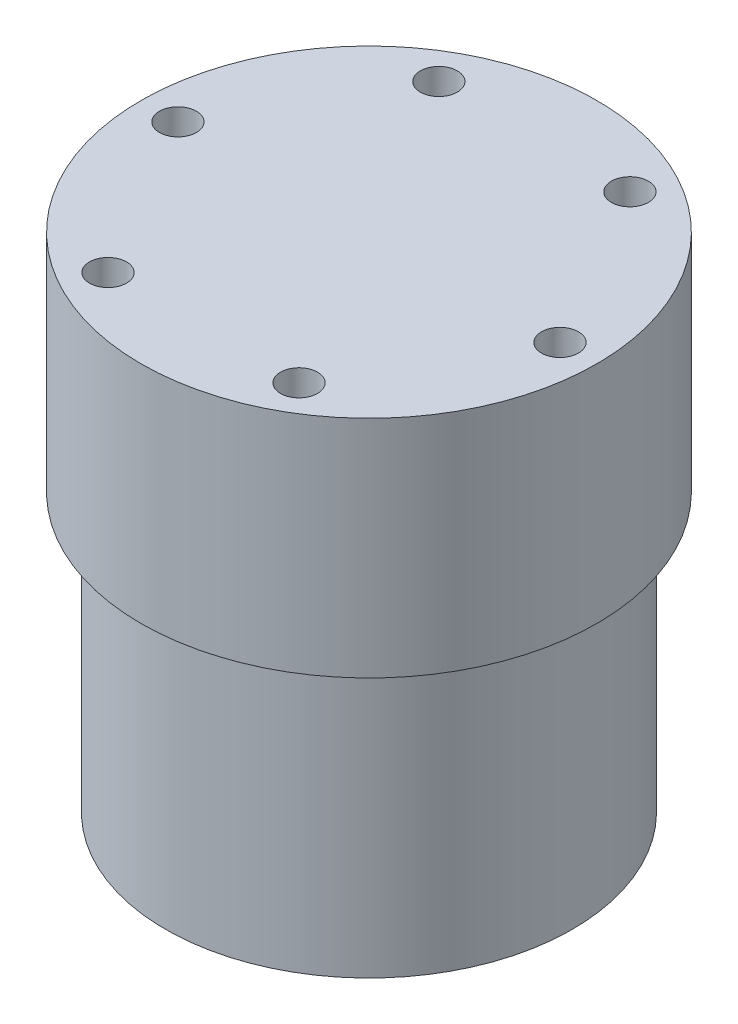
ISO-10303-21;
HEADER;
FILE_DESCRIPTION(('STEP AP214'),'2;1');
FILE_NAME('part.step','',(''),(''),'','','');
FILE_SCHEMA(('AUTOMOTIVE_DESIGN { 1 0 10303 214 1 1 1 1 }'));
ENDSEC;
DATA;
#1=APPLICATION_CONTEXT('core data for automotive mechanical design processes');
#2=APPLICATION_PROTOCOL_DEFINITION('international standard','automotive_design',2000,#1);
#3=PRODUCT_CONTEXT('',#1,'mechanical');
#4=PRODUCT('Part','Part','',(#3));
#5=PRODUCT_RELATED_PRODUCT_CATEGORY('part','',(#4));
#6=PRODUCT_DEFINITION_FORMATION('','',#4);
#7=PRODUCT_DEFINITION_CONTEXT('part definition',#1,'design');
#8=PRODUCT_DEFINITION('design','',#6,#7);
#9=PRODUCT_DEFINITION_SHAPE('','',#8);
#10=(LENGTH_UNIT() NAMED_UNIT(*) SI_UNIT(.MILLI.,.METRE.));
#11=(NAMED_UNIT(*) PLANE_ANGLE_UNIT() SI_UNIT($,.RADIAN.));
#12=(NAMED_UNIT(*) SI_UNIT($,.STERADIAN.) SOLID_ANGLE_UNIT());
#13=UNCERTAINTY_MEASURE_WITH_UNIT(LENGTH_MEASURE(1.E-05),#10,'distance_accuracy_value','');
#14=(GEOMETRIC_REPRESENTATION_CONTEXT(3) GLOBAL_UNCERTAINTY_ASSIGNED_CONTEXT((#13)) GLOBAL_UNIT_ASSIGNED_CONTEXT((#10,
#11,#12)) REPRESENTATION_CONTEXT('',''));
#15=CARTESIAN_POINT('',(0.,0.,0.));
#16=DIRECTION('',(0.,0.,1.));
#17=DIRECTION('',(1.,0.,0.));
#18=AXIS2_PLACEMENT_3D('',#15,#16,#17);
#19=CARTESIAN_POINT('',(0.,22.5,0.));
#20=DIRECTION('',(0.,-1.,0.));
#21=DIRECTION('',(0.,0.,-1.));
#22=AXIS2_PLACEMENT_3D('',#19,#20,#21);
#23=CYLINDRICAL_SURFACE('',#22,16.5);
#24=CARTESIAN_POINT('',(0.,22.5,0.));
#25=DIRECTION('',(0.,1.,0.));
#26=DIRECTION('',(0.,0.,1.));
#27=AXIS2_PLACEMENT_3D('',#24,#25,#26);
#28=CIRCLE('',#27,16.5);
#29=CARTESIAN_POINT('',(0.,22.5,-16.5));
#30=VERTEX_POINT('',#29);
#31=EDGE_CURVE('E10',#30,#30,#28,.T.);
#32=CARTESIAN_POINT('',(0.,0.,0.));
#33=DIRECTION('',(0.,1.,0.));
#34=DIRECTION('',(0.,0.,1.));
#35=AXIS2_PLACEMENT_3D('',#32,#33,#34);
#36=CIRCLE('',#35,16.5);
#37=CARTESIAN_POINT('',(0.,0.,-16.5));
#38=VERTEX_POINT('',#37);
#39=EDGE_CURVE('E33',#38,#38,#36,.T.);
#40=CARTESIAN_POINT('',(0.,22.5,-16.5));
#41=CARTESIAN_POINT('',(0.,22.265625,-16.5));
#42=CARTESIAN_POINT('',(0.,22.03125,-16.5));
#43=CARTESIAN_POINT('',(0.,21.5625,-16.5));
#44=CARTESIAN_POINT('',(0.,21.328125,-16.5));
#45=CARTESIAN_POINT('',(0.,20.859375,-16.5));
#46=CARTESIAN_POINT('',(0.,20.625,-16.5));
#47=CARTESIAN_POINT('',(0.,20.15625,-16.5));
#48=CARTESIAN_POINT('',(0.,19.921875,-16.5));
#49=CARTESIAN_POINT('',(0.,19.453125,-16.5));
#50=CARTESIAN_POINT('',(0.,19.21875,-16.5));
#51=CARTESIAN_POINT('',(0.,18.75,-16.5));
#52=CARTESIAN_POINT('',(0.,18.515625,-16.5));
#53=CARTESIAN_POINT('',(0.,18.046875,-16.5));
#54=CARTESIAN_POINT('',(0.,17.8125,-16.5));
#55=CARTESIAN_POINT('',(0.,17.34375,-16.5));
#56=CARTESIAN_POINT('',(0.,17.109375,-16.5));
#57=CARTESIAN_POINT('',(0.,16.640625,-16.5));
#58=CARTESIAN_POINT('',(0.,16.40625,-16.5));
#59=CARTESIAN_POINT('',(0.,15.9375,-16.5));
#60=CARTESIAN_POINT('',(0.,15.703125,-16.5));
#61=CARTESIAN_POINT('',(0.,15.234375,-16.5));
#62=CARTESIAN_POINT('',(0.,15.,-16.5));
#63=CARTESIAN_POINT('',(0.,14.53125,-16.5));
#64=CARTESIAN_POINT('',(0.,14.296875,-16.5));
#65=CARTESIAN_POINT('',(0.,13.828125,-16.5));
#66=CARTESIAN_POINT('',(0.,13.59375,-16.5));
#67=CARTESIAN_POINT('',(0.,13.125,-16.5));
#68=CARTESIAN_POINT('',(0.,12.890625,-16.5));
#69=CARTESIAN_POINT('',(0.,12.421875,-16.5));
#70=CARTESIAN_POINT('',(0.,12.1875,-16.5));
#71=CARTESIAN_POINT('',(0.,11.71875,-16.5));
#72=CARTESIAN_POINT('',(0.,11.484375,-16.5));
#73=CARTESIAN_POINT('',(0.,11.015625,-16.5));
#74=CARTESIAN_POINT('',(0.,10.78125,-16.5));
#75=CARTESIAN_POINT('',(0.,10.3125,-16.5));
#76=CARTESIAN_POINT('',(0.,10.078125,-16.5));
#77=CARTESIAN_POINT('',(0.,9.609375,-16.5));
#78=CARTESIAN_POINT('',(0.,9.375,-16.5));
#79=CARTESIAN_POINT('',(0.,8.90625,-16.5));
#80=CARTESIAN_POINT('',(0.,8.671875,-16.5));
#81=CARTESIAN_POINT('',(0.,8.203125,-16.5));
#82=CARTESIAN_POINT('',(0.,7.96875,-16.5));
#83=CARTESIAN_POINT('',(0.,7.5,-16.5));
#84=CARTESIAN_POINT('',(0.,7.265625,-16.5));
#85=CARTESIAN_POINT('',(0.,6.796875,-16.5));
#86=CARTESIAN_POINT('',(0.,6.5625,-16.5));
#87=CARTESIAN_POINT('',(0.,6.09375,-16.5));
#88=CARTESIAN_POINT('',(0.,5.859375,-16.5));
#89=CARTESIAN_POINT('',(0.,5.390625,-16.5));
#90=CARTESIAN_POINT('',(0.,5.15625,-16.5));
#91=CARTESIAN_POINT('',(0.,4.6875,-16.5));
#92=CARTESIAN_POINT('',(0.,4.453125,-16.5));
#93=CARTESIAN_POINT('',(0.,3.984375,-16.5));
#94=CARTESIAN_POINT('',(0.,3.75,-16.5));
#95=CARTESIAN_POINT('',(0.,3.28125,-16.5));
#96=CARTESIAN_POINT('',(0.,3.046875,-16.5));
#97=CARTESIAN_POINT('',(0.,2.578125,-16.5));
#98=CARTESIAN_POINT('',(0.,2.34375,-16.5));
#99=CARTESIAN_POINT('',(0.,1.875,-16.5));
#100=CARTESIAN_POINT('',(0.,1.640625,-16.5));
#101=CARTESIAN_POINT('',(0.,1.171875,-16.5));
#102=CARTESIAN_POINT('',(0.,0.937499999999996,-16.5));
#103=CARTESIAN_POINT('',(0.,0.468749999999996,-16.5));
#104=CARTESIAN_POINT('',(0.,0.234374999999996,-16.5));
#105=CARTESIAN_POINT('',(0.,0.,-16.5));
#106=B_SPLINE_CURVE_WITH_KNOTS('',3,(#40,#41,#42,#43,#44,#45,#46,#47,#48,#49,#50,#51,#52,#53,
#54,#55,#56,#57,#58,#59,#60,#61,#62,#63,#64,#65,#66,#67,#68,#69,#70,#71,#72,#73,#74,#75,#76,#77,
#78,#79,#80,#81,#82,#83,#84,#85,#86,#87,#88,#89,#90,#91,#92,#93,#94,#95,#96,#97,#98,#99,#100,
#101,#102,#103,#104,#105),.UNSPECIFIED.,.F.,.F.,(4,2,2,2,2,2,2,2,2,2,2,2,2,2,2,2,2,2,2,2,2,2,2,
2,2,2,2,2,2,2,2,2,4),(0.,0.703124999999999,1.40625,2.109375,2.8125,3.515625,4.21875,4.921875,
5.625,6.328125,7.03125,7.734375,8.4375,9.140625,9.84375,10.546875,11.25,11.953125,12.65625,
13.359375,14.0625,14.765625,15.46875,16.171875,16.875,17.578125,18.28125,18.984375,19.6875,
20.390625,21.09375,21.796875,22.5),.UNSPECIFIED.);
#107=EDGE_CURVE('BSEAM30',#30,#38,#106,.T.);
#108=ORIENTED_EDGE('',*,*,#31,.F.);
#109=ORIENTED_EDGE('',*,*,#39,.T.);
#110=ORIENTED_EDGE('',*,*,#107,.T.);
#111=ORIENTED_EDGE('',*,*,#107,.F.);
#112=EDGE_LOOP('',(#108,#110,#109,#111));
#113=FACE_BOUND('',#112,.T.);
#114=ADVANCED_FACE('F30',(#113),#23,.T.);
#115=CARTESIAN_POINT('',(0.,0.,0.));
#116=DIRECTION('',(0.,1.,0.));
#117=DIRECTION('',(0.,0.,1.));
#118=AXIS2_PLACEMENT_3D('',#115,#116,#117);
#119=PLANE('',#118);
#120=ORIENTED_EDGE('',*,*,#39,.F.);
#121=EDGE_LOOP('',(#120));
#122=FACE_BOUND('',#121,.T.);
#123=ADVANCED_FACE('F113',(#122),#119,.F.);
#124=CARTESIAN_POINT('',(0.,40.75,0.));
#125=DIRECTION('',(0.,-1.,0.));
#126=DIRECTION('',(0.,0.,-1.));
#127=AXIS2_PLACEMENT_3D('',#124,#125,#126);
#128=CYLINDRICAL_SURFACE('',#127,18.5);
#129=CARTESIAN_POINT('',(0.,40.75,0.));
#130=DIRECTION('',(0.,1.,0.));
#131=DIRECTION('',(0.,0.,1.));
#132=AXIS2_PLACEMENT_3D('',#129,#130,#131);
#133=CIRCLE('',#132,18.5);
#134=CARTESIAN_POINT('',(0.,40.75,18.5));
#135=VERTEX_POINT('',#134);
#136=EDGE_CURVE('E40',#135,#135,#133,.T.);
#137=ORIENTED_EDGE('',*,*,#136,.F.);
#138=EDGE_LOOP('',(#137));
#139=FACE_BOUND('',#138,.T.);
#140=CARTESIAN_POINT('',(0.,22.5,0.));
#141=DIRECTION('',(0.,1.,0.));
#142=DIRECTION('',(0.,0.,1.));
#143=AXIS2_PLACEMENT_3D('',#140,#141,#142);
#144=CIRCLE('',#143,18.5);
#145=CARTESIAN_POINT('',(0.,22.5,18.5));
#146=VERTEX_POINT('',#145);
#147=EDGE_CURVE('E42',#146,#146,#144,.T.);
#148=ORIENTED_EDGE('',*,*,#147,.T.);
#149=EDGE_LOOP('',(#148));
#150=FACE_BOUND('',#149,.T.);
#151=ADVANCED_FACE('F97',(#139,#150),#128,.T.);
#152=CARTESIAN_POINT('',(0.,40.75,0.));
#153=DIRECTION('',(0.,1.,0.));
#154=DIRECTION('',(0.,0.,1.));
#155=AXIS2_PLACEMENT_3D('',#152,#153,#154);
#156=PLANE('',#155);
#157=CARTESIAN_POINT('',(15.5,40.75,0.));
#158=DIRECTION('',(0.,1.,0.));
#159=DIRECTION('',(0.,0.,1.));
#160=AXIS2_PLACEMENT_3D('',#157,#158,#159);
#161=CIRCLE('',#160,1.5);
#162=CARTESIAN_POINT('',(15.5,40.75,1.5));
#163=VERTEX_POINT('',#162);
#164=EDGE_CURVE('E61',#163,#163,#161,.T.);
#165=ORIENTED_EDGE('',*,*,#164,.F.);
#166=EDGE_LOOP('',(#165));
#167=FACE_BOUND('',#166,.T.);
#168=CARTESIAN_POINT('',(-7.75000000000002,40.75,13.4233937586588));
#169=DIRECTION('',(0.,1.,0.));
#170=DIRECTION('',(0.,0.,1.));
#171=AXIS2_PLACEMENT_3D('',#168,#169,#170);
#172=CIRCLE('',#171,1.5);
#173=CARTESIAN_POINT('',(-7.75000000000002,40.75,14.9233937586588));
#174=VERTEX_POINT('',#173);
#175=EDGE_CURVE('E74',#174,#174,#172,.T.);
#176=ORIENTED_EDGE('',*,*,#175,.F.);
#177=EDGE_LOOP('',(#176));
#178=FACE_BOUND('',#177,.T.);
#179=CARTESIAN_POINT('',(7.75000000000002,40.75,-13.4233937586588));
#180=DIRECTION('',(0.,1.,0.));
#181=DIRECTION('',(0.,0.,1.));
#182=AXIS2_PLACEMENT_3D('',#179,#180,#181);
#183=CIRCLE('',#182,1.5);
#184=CARTESIAN_POINT('',(7.75000000000002,40.75,-11.9233937586588));
#185=VERTEX_POINT('',#184);
#186=EDGE_CURVE('E55',#185,#185,#183,.T.);
#187=ORIENTED_EDGE('',*,*,#186,.F.);
#188=EDGE_LOOP('',(#187));
#189=FACE_BOUND('',#188,.T.);
#190=CARTESIAN_POINT('',(-15.5,40.75,0.));
#191=DIRECTION('',(0.,1.,0.));
#192=DIRECTION('',(0.,0.,-1.));
#193=AXIS2_PLACEMENT_3D('',#190,#191,#192);
#194=CIRCLE('',#193,1.5);
#195=CARTESIAN_POINT('',(-15.5,40.75,-1.5));
#196=VERTEX_POINT('',#195);
#197=EDGE_CURVE('E48',#196,#196,#194,.T.);
#198=ORIENTED_EDGE('',*,*,#197,.F.);
#199=EDGE_LOOP('',(#198));
#200=FACE_BOUND('',#199,.T.);
#201=CARTESIAN_POINT('',(-7.75000000000002,40.75,-13.4233937586588));
#202=DIRECTION('',(0.,1.,0.));
#203=DIRECTION('',(0.,0.,-1.));
#204=AXIS2_PLACEMENT_3D('',#201,#202,#203);
#205=CIRCLE('',#204,1.5);
#206=CARTESIAN_POINT('',(-7.75000000000002,40.75,-14.9233937586588));
#207=VERTEX_POINT('',#206);
#208=EDGE_CURVE('E69',#207,#207,#205,.T.);
#209=ORIENTED_EDGE('',*,*,#208,.F.);
#210=EDGE_LOOP('',(#209));
#211=FACE_BOUND('',#210,.T.);
#212=CARTESIAN_POINT('',(7.75000000000002,40.75,13.4233937586588));
#213=DIRECTION('',(0.,1.,0.));
#214=DIRECTION('',(0.,0.,-1.));
#215=AXIS2_PLACEMENT_3D('',#212,#213,#214);
#216=CIRCLE('',#215,1.5);
#217=CARTESIAN_POINT('',(7.75000000000002,40.75,11.9233937586588));
#218=VERTEX_POINT('',#217);
#219=EDGE_CURVE('E62',#218,#218,#216,.T.);
#220=ORIENTED_EDGE('',*,*,#219,.F.);
#221=EDGE_LOOP('',(#220));
#222=FACE_BOUND('',#221,.T.);
#223=ORIENTED_EDGE('',*,*,#136,.T.);
#224=EDGE_LOOP('',(#223));
#225=FACE_BOUND('',#224,.T.);
#226=ADVANCED_FACE('F93',(#167,#178,#189,#200,#211,#222,#225),#156,.T.);
#227=CARTESIAN_POINT('',(0.,22.5,0.));
#228=DIRECTION('',(0.,1.,0.));
#229=DIRECTION('',(0.,0.,1.));
#230=AXIS2_PLACEMENT_3D('',#227,#228,#229);
#231=PLANE('',#230);
#232=ORIENTED_EDGE('',*,*,#31,.T.);
#233=EDGE_LOOP('',(#232));
#234=FACE_BOUND('',#233,.T.);
#235=ORIENTED_EDGE('',*,*,#147,.F.);
#236=EDGE_LOOP('',(#235));
#237=FACE_BOUND('',#236,.T.);
#238=ADVANCED_FACE('F96',(#234,#237),#231,.F.);
#239=CARTESIAN_POINT('',(7.75000000000002,34.75,13.4233937586588));
#240=DIRECTION('',(0.,1.,0.));
#241=DIRECTION('',(0.,0.,1.));
#242=AXIS2_PLACEMENT_3D('',#239,#240,#241);
#243=CYLINDRICAL_SURFACE('',#242,1.5);
#244=CARTESIAN_POINT('',(7.75000000000002,34.75,13.4233937586588));
#245=DIRECTION('',(0.,1.,0.));
#246=DIRECTION('',(0.,0.,-1.));
#247=AXIS2_PLACEMENT_3D('',#244,#245,#246);
#248=CIRCLE('',#247,1.5);
#249=CARTESIAN_POINT('',(7.75000000000002,34.75,11.9233937586588));
#250=VERTEX_POINT('',#249);
#251=EDGE_CURVE('E65',#250,#250,#248,.T.);
#252=ORIENTED_EDGE('',*,*,#251,.F.);
#253=EDGE_LOOP('',(#252));
#254=FACE_BOUND('',#253,.T.);
#255=ORIENTED_EDGE('',*,*,#219,.T.);
#256=EDGE_LOOP('',(#255));
#257=FACE_BOUND('',#256,.T.);
#258=ADVANCED_FACE('F118',(#254,#257),#243,.F.);
#259=CARTESIAN_POINT('',(7.75000000000002,34.75,13.4233937586588));
#260=DIRECTION('',(0.,-1.,0.));
#261=DIRECTION('',(0.,0.,-1.));
#262=AXIS2_PLACEMENT_3D('',#259,#260,#261);
#263=PLANE('',#262);
#264=ORIENTED_EDGE('',*,*,#251,.T.);
#265=EDGE_LOOP('',(#264));
#266=FACE_BOUND('',#265,.T.);
#267=ADVANCED_FACE('F123',(#266),#263,.F.);
#268=CARTESIAN_POINT('',(-7.75000000000002,34.75,-13.4233937586588));
#269=DIRECTION('',(0.,1.,0.));
#270=DIRECTION('',(0.,0.,1.));
#271=AXIS2_PLACEMENT_3D('',#268,#269,#270);
#272=CYLINDRICAL_SURFACE('',#271,1.5);
#273=CARTESIAN_POINT('',(-7.75000000000002,34.75,-13.4233937586588));
#274=DIRECTION('',(0.,1.,0.));
#275=DIRECTION('',(0.,0.,-1.));
#276=AXIS2_PLACEMENT_3D('',#273,#274,#275);
#277=CIRCLE('',#276,1.5);
#278=CARTESIAN_POINT('',(-7.75000000000002,34.75,-14.9233937586588));
#279=VERTEX_POINT('',#278);
#280=EDGE_CURVE('E52',#279,#279,#277,.T.);
#281=ORIENTED_EDGE('',*,*,#280,.F.);
#282=EDGE_LOOP('',(#281));
#283=FACE_BOUND('',#282,.T.);
#284=ORIENTED_EDGE('',*,*,#208,.T.);
#285=EDGE_LOOP('',(#284));
#286=FACE_BOUND('',#285,.T.);
#287=ADVANCED_FACE('F161',(#283,#286),#272,.F.);
#288=CARTESIAN_POINT('',(-7.75000000000002,34.75,-13.4233937586588));
#289=DIRECTION('',(0.,-1.,0.));
#290=DIRECTION('',(0.,0.,-1.));
#291=AXIS2_PLACEMENT_3D('',#288,#289,#290);
#292=PLANE('',#291);
#293=ORIENTED_EDGE('',*,*,#280,.T.);
#294=EDGE_LOOP('',(#293));
#295=FACE_BOUND('',#294,.T.);
#296=ADVANCED_FACE('F171',(#295),#292,.F.);
#297=CARTESIAN_POINT('',(-15.5,34.75,0.));
#298=DIRECTION('',(0.,1.,0.));
#299=DIRECTION('',(0.,0.,1.));
#300=AXIS2_PLACEMENT_3D('',#297,#298,#299);
#301=CYLINDRICAL_SURFACE('',#300,1.5);
#302=CARTESIAN_POINT('',(-15.5,34.75,0.));
#303=DIRECTION('',(0.,1.,0.));
#304=DIRECTION('',(0.,0.,-1.));
#305=AXIS2_PLACEMENT_3D('',#302,#303,#304);
#306=CIRCLE('',#305,1.5);
#307=CARTESIAN_POINT('',(-15.5,34.75,-1.5));
#308=VERTEX_POINT('',#307);
#309=EDGE_CURVE('E51',#308,#308,#306,.T.);
#310=ORIENTED_EDGE('',*,*,#309,.F.);
#311=EDGE_LOOP('',(#310));
#312=FACE_BOUND('',#311,.T.);
#313=ORIENTED_EDGE('',*,*,#197,.T.);
#314=EDGE_LOOP('',(#313));
#315=FACE_BOUND('',#314,.T.);
#316=ADVANCED_FACE('F181',(#312,#315),#301,.F.);
#317=CARTESIAN_POINT('',(-15.5,34.75,0.));
#318=DIRECTION('',(0.,-1.,0.));
#319=DIRECTION('',(0.,0.,-1.));
#320=AXIS2_PLACEMENT_3D('',#317,#318,#319);
#321=PLANE('',#320);
#322=ORIENTED_EDGE('',*,*,#309,.T.);
#323=EDGE_LOOP('',(#322));
#324=FACE_BOUND('',#323,.T.);
#325=ADVANCED_FACE('F191',(#324),#321,.F.);
#326=CARTESIAN_POINT('',(7.75000000000002,34.75,-13.4233937586588));
#327=DIRECTION('',(0.,1.,0.));
#328=DIRECTION('',(0.,0.,1.));
#329=AXIS2_PLACEMENT_3D('',#326,#327,#328);
#330=CYLINDRICAL_SURFACE('',#329,1.5);
#331=CARTESIAN_POINT('',(7.75000000000002,34.75,-13.4233937586588));
#332=DIRECTION('',(0.,1.,0.));
#333=DIRECTION('',(0.,0.,1.));
#334=AXIS2_PLACEMENT_3D('',#331,#332,#333);
#335=CIRCLE('',#334,1.5);
#336=CARTESIAN_POINT('',(7.75000000000002,34.75,-11.9233937586588));
#337=VERTEX_POINT('',#336);
#338=EDGE_CURVE('E58',#337,#337,#335,.T.);
#339=ORIENTED_EDGE('',*,*,#338,.F.);
#340=EDGE_LOOP('',(#339));
#341=FACE_BOUND('',#340,.T.);
#342=ORIENTED_EDGE('',*,*,#186,.T.);
#343=EDGE_LOOP('',(#342));
#344=FACE_BOUND('',#343,.T.);
#345=ADVANCED_FACE('F201',(#341,#344),#330,.F.);
#346=CARTESIAN_POINT('',(7.75000000000002,34.75,-13.4233937586588));
#347=DIRECTION('',(0.,1.,0.));
#348=DIRECTION('',(0.,0.,1.));
#349=AXIS2_PLACEMENT_3D('',#346,#347,#348);
#350=PLANE('',#349);
#351=ORIENTED_EDGE('',*,*,#338,.T.);
#352=EDGE_LOOP('',(#351));
#353=FACE_BOUND('',#352,.T.);
#354=ADVANCED_FACE('F211',(#353),#350,.T.);
#355=CARTESIAN_POINT('',(-7.75000000000002,34.75,13.4233937586588));
#356=DIRECTION('',(0.,1.,0.));
#357=DIRECTION('',(0.,0.,1.));
#358=AXIS2_PLACEMENT_3D('',#355,#356,#357);
#359=CYLINDRICAL_SURFACE('',#358,1.5);
#360=CARTESIAN_POINT('',(-7.75000000000002,34.75,13.4233937586588));
#361=DIRECTION('',(0.,1.,0.));
#362=DIRECTION('',(0.,0.,1.));
#363=AXIS2_PLACEMENT_3D('',#360,#361,#362);
#364=CIRCLE('',#363,1.5);
#365=CARTESIAN_POINT('',(-7.75000000000002,34.75,14.9233937586588));
#366=VERTEX_POINT('',#365);
#367=EDGE_CURVE('E66',#366,#366,#364,.T.);
#368=ORIENTED_EDGE('',*,*,#367,.F.);
#369=EDGE_LOOP('',(#368));
#370=FACE_BOUND('',#369,.T.);
#371=ORIENTED_EDGE('',*,*,#175,.T.);
#372=EDGE_LOOP('',(#371));
#373=FACE_BOUND('',#372,.T.);
#374=ADVANCED_FACE('F221',(#370,#373),#359,.F.);
#375=CARTESIAN_POINT('',(-7.75000000000002,34.75,13.4233937586588));
#376=DIRECTION('',(0.,1.,0.));
#377=DIRECTION('',(0.,0.,1.));
#378=AXIS2_PLACEMENT_3D('',#375,#376,#377);
#379=PLANE('',#378);
#380=ORIENTED_EDGE('',*,*,#367,.T.);
#381=EDGE_LOOP('',(#380));
#382=FACE_BOUND('',#381,.T.);
#383=ADVANCED_FACE('F89',(#382),#379,.T.);
#384=CARTESIAN_POINT('',(15.5,34.75,0.));
#385=DIRECTION('',(0.,1.,0.));
#386=DIRECTION('',(0.,0.,1.));
#387=AXIS2_PLACEMENT_3D('',#384,#385,#386);
#388=CYLINDRICAL_SURFACE('',#387,1.5);
#389=CARTESIAN_POINT('',(15.5,34.75,0.));
#390=DIRECTION('',(0.,1.,0.));
#391=DIRECTION('',(0.,0.,1.));
#392=AXIS2_PLACEMENT_3D('',#389,#390,#391);
#393=CIRCLE('',#392,1.5);
#394=CARTESIAN_POINT('',(15.5,34.75,1.5));
#395=VERTEX_POINT('',#394);
#396=EDGE_CURVE('E45',#395,#395,#393,.T.);
#397=ORIENTED_EDGE('',*,*,#396,.F.);
#398=EDGE_LOOP('',(#397));
#399=FACE_BOUND('',#398,.T.);
#400=ORIENTED_EDGE('',*,*,#164,.T.);
#401=EDGE_LOOP('',(#400));
#402=FACE_BOUND('',#401,.T.);
#403=ADVANCED_FACE('F86',(#399,#402),#388,.F.);
#404=CARTESIAN_POINT('',(15.5,34.75,0.));
#405=DIRECTION('',(0.,1.,0.));
#406=DIRECTION('',(0.,0.,1.));
#407=AXIS2_PLACEMENT_3D('',#404,#405,#406);
#408=PLANE('',#407);
#409=ORIENTED_EDGE('',*,*,#396,.T.);
#410=EDGE_LOOP('',(#409));
#411=FACE_BOUND('',#410,.T.);
#412=ADVANCED_FACE('F84',(#411),#408,.T.);
#413=CLOSED_SHELL('',(#114,#123,#151,#226,#238,#258,#267,#287,#296,#316,#325,#345,#354,#374,
#383,#403,#412));
#414=MANIFOLD_SOLID_BREP('B2',#413);
#415=ADVANCED_BREP_SHAPE_REPRESENTATION('',(#18,#414),#14);
#416=SHAPE_DEFINITION_REPRESENTATION(#9,#415);
ENDSEC;
END-ISO-10303-21;
